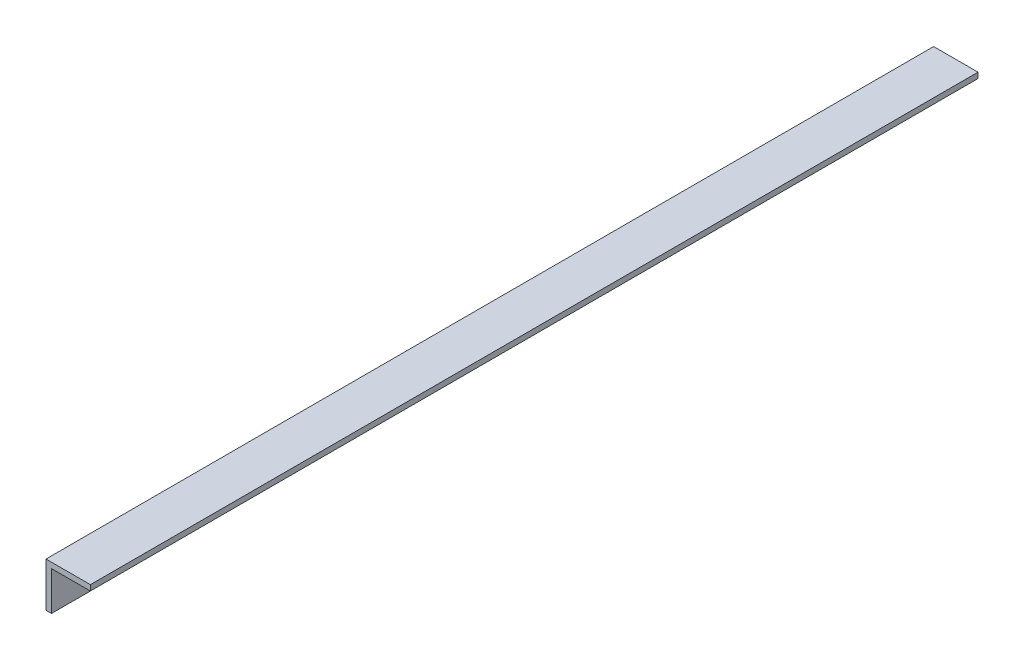
ISO-10303-21;
HEADER;
FILE_DESCRIPTION(('STEP AP214'),'2;1');
FILE_NAME('part.step','',(''),(''),'','','');
FILE_SCHEMA(('AUTOMOTIVE_DESIGN { 1 0 10303 214 1 1 1 1 }'));
ENDSEC;
DATA;
#1=APPLICATION_CONTEXT('core data for automotive mechanical design processes');
#2=APPLICATION_PROTOCOL_DEFINITION('international standard','automotive_design',2000,#1);
#3=PRODUCT_CONTEXT('',#1,'mechanical');
#4=PRODUCT('Part','Part','',(#3));
#5=PRODUCT_RELATED_PRODUCT_CATEGORY('part','',(#4));
#6=PRODUCT_DEFINITION_FORMATION('','',#4);
#7=PRODUCT_DEFINITION_CONTEXT('part definition',#1,'design');
#8=PRODUCT_DEFINITION('design','',#6,#7);
#9=PRODUCT_DEFINITION_SHAPE('','',#8);
#10=(LENGTH_UNIT() NAMED_UNIT(*) SI_UNIT(.MILLI.,.METRE.));
#11=(NAMED_UNIT(*) PLANE_ANGLE_UNIT() SI_UNIT($,.RADIAN.));
#12=(NAMED_UNIT(*) SI_UNIT($,.STERADIAN.) SOLID_ANGLE_UNIT());
#13=UNCERTAINTY_MEASURE_WITH_UNIT(LENGTH_MEASURE(1.E-05),#10,'distance_accuracy_value','');
#14=(GEOMETRIC_REPRESENTATION_CONTEXT(3) GLOBAL_UNCERTAINTY_ASSIGNED_CONTEXT((#13)) GLOBAL_UNIT_ASSIGNED_CONTEXT((#10,
#11,#12)) REPRESENTATION_CONTEXT('',''));
#15=CARTESIAN_POINT('',(0.,0.,0.));
#16=DIRECTION('',(0.,0.,1.));
#17=DIRECTION('',(1.,0.,0.));
#18=AXIS2_PLACEMENT_3D('',#15,#16,#17);
#19=CARTESIAN_POINT('',(3.175,0.,508.));
#20=DIRECTION('',(0.,1.,0.));
#21=DIRECTION('',(-1.,0.,0.));
#22=AXIS2_PLACEMENT_3D('',#19,#20,#21);
#23=PLANE('',#22);
#24=DIRECTION('',(1.,0.,0.));
#25=VECTOR('',#24,1.);
#26=CARTESIAN_POINT('',(3.175,0.,0.));
#27=LINE('',#26,#25);
#28=CARTESIAN_POINT('',(0.,0.,0.));
#29=VERTEX_POINT('',#28);
#30=CARTESIAN_POINT('',(3.175,0.,0.));
#31=VERTEX_POINT('',#30);
#32=EDGE_CURVE('E117',#29,#31,#27,.T.);
#33=ORIENTED_EDGE('',*,*,#32,.T.);
#34=DIRECTION('',(0.,0.,-1.));
#35=VECTOR('',#34,1.);
#36=CARTESIAN_POINT('',(3.175,0.,508.));
#37=LINE('',#36,#35);
#38=CARTESIAN_POINT('',(3.175,0.,508.));
#39=VERTEX_POINT('',#38);
#40=EDGE_CURVE('E11',#39,#31,#37,.T.);
#41=ORIENTED_EDGE('',*,*,#40,.F.);
#42=DIRECTION('',(1.,0.,0.));
#43=VECTOR('',#42,1.);
#44=CARTESIAN_POINT('',(3.175,0.,508.));
#45=LINE('',#44,#43);
#46=CARTESIAN_POINT('',(0.,0.,508.));
#47=VERTEX_POINT('',#46);
#48=EDGE_CURVE('E127',#47,#39,#45,.T.);
#49=ORIENTED_EDGE('',*,*,#48,.F.);
#50=DIRECTION('',(0.,0.,-1.));
#51=VECTOR('',#50,1.);
#52=CARTESIAN_POINT('',(0.,0.,508.));
#53=LINE('',#52,#51);
#54=EDGE_CURVE('E113',#47,#29,#53,.T.);
#55=ORIENTED_EDGE('',*,*,#54,.T.);
#56=EDGE_LOOP('',(#33,#41,#49,#55));
#57=FACE_BOUND('',#56,.T.);
#58=ADVANCED_FACE('F33',(#57),#23,.F.);
#59=CARTESIAN_POINT('',(3.175,22.225,508.));
#60=DIRECTION('',(-1.,0.,0.));
#61=DIRECTION('',(0.,-1.,0.));
#62=AXIS2_PLACEMENT_3D('',#59,#60,#61);
#63=PLANE('',#62);
#64=DIRECTION('',(0.,1.,0.));
#65=VECTOR('',#64,1.);
#66=CARTESIAN_POINT('',(3.175,22.225,0.));
#67=LINE('',#66,#65);
#68=CARTESIAN_POINT('',(3.175,22.225,0.));
#69=VERTEX_POINT('',#68);
#70=EDGE_CURVE('E120',#31,#69,#67,.T.);
#71=ORIENTED_EDGE('',*,*,#70,.T.);
#72=DIRECTION('',(0.,0.,-1.));
#73=VECTOR('',#72,1.);
#74=CARTESIAN_POINT('',(3.175,22.225,508.));
#75=LINE('',#74,#73);
#76=CARTESIAN_POINT('',(3.175,22.225,508.));
#77=VERTEX_POINT('',#76);
#78=EDGE_CURVE('E41',#77,#69,#75,.T.);
#79=ORIENTED_EDGE('',*,*,#78,.F.);
#80=DIRECTION('',(0.,1.,0.));
#81=VECTOR('',#80,1.);
#82=CARTESIAN_POINT('',(3.175,22.225,508.));
#83=LINE('',#82,#81);
#84=EDGE_CURVE('E86',#39,#77,#83,.T.);
#85=ORIENTED_EDGE('',*,*,#84,.F.);
#86=ORIENTED_EDGE('',*,*,#40,.T.);
#87=EDGE_LOOP('',(#71,#79,#85,#86));
#88=FACE_BOUND('',#87,.T.);
#89=ADVANCED_FACE('F151',(#88),#63,.F.);
#90=CARTESIAN_POINT('',(25.4,22.225,508.));
#91=DIRECTION('',(0.,1.,0.));
#92=DIRECTION('',(-1.,0.,0.));
#93=AXIS2_PLACEMENT_3D('',#90,#91,#92);
#94=PLANE('',#93);
#95=DIRECTION('',(1.,0.,0.));
#96=VECTOR('',#95,1.);
#97=CARTESIAN_POINT('',(25.4,22.225,0.));
#98=LINE('',#97,#96);
#99=CARTESIAN_POINT('',(25.4,22.225,0.));
#100=VERTEX_POINT('',#99);
#101=EDGE_CURVE('E122',#69,#100,#98,.T.);
#102=ORIENTED_EDGE('',*,*,#101,.T.);
#103=DIRECTION('',(0.,0.,-1.));
#104=VECTOR('',#103,1.);
#105=CARTESIAN_POINT('',(25.4,22.225,508.));
#106=LINE('',#105,#104);
#107=CARTESIAN_POINT('',(25.4,22.225,508.));
#108=VERTEX_POINT('',#107);
#109=EDGE_CURVE('E108',#108,#100,#106,.T.);
#110=ORIENTED_EDGE('',*,*,#109,.F.);
#111=DIRECTION('',(1.,0.,0.));
#112=VECTOR('',#111,1.);
#113=CARTESIAN_POINT('',(25.4,22.225,508.));
#114=LINE('',#113,#112);
#115=EDGE_CURVE('E99',#77,#108,#114,.T.);
#116=ORIENTED_EDGE('',*,*,#115,.F.);
#117=ORIENTED_EDGE('',*,*,#78,.T.);
#118=EDGE_LOOP('',(#102,#110,#116,#117));
#119=FACE_BOUND('',#118,.T.);
#120=ADVANCED_FACE('F133',(#119),#94,.F.);
#121=CARTESIAN_POINT('',(25.4,25.4,508.));
#122=DIRECTION('',(-1.,0.,0.));
#123=DIRECTION('',(0.,0.,1.));
#124=AXIS2_PLACEMENT_3D('',#121,#122,#123);
#125=PLANE('',#124);
#126=DIRECTION('',(0.,1.,0.));
#127=VECTOR('',#126,1.);
#128=CARTESIAN_POINT('',(25.4,25.4,0.));
#129=LINE('',#128,#127);
#130=CARTESIAN_POINT('',(25.4,25.4,0.));
#131=VERTEX_POINT('',#130);
#132=EDGE_CURVE('E107',#100,#131,#129,.T.);
#133=ORIENTED_EDGE('',*,*,#132,.T.);
#134=DIRECTION('',(0.,0.,-1.));
#135=VECTOR('',#134,1.);
#136=CARTESIAN_POINT('',(25.4,25.4,508.));
#137=LINE('',#136,#135);
#138=CARTESIAN_POINT('',(25.4,25.4,508.));
#139=VERTEX_POINT('',#138);
#140=EDGE_CURVE('E104',#139,#131,#137,.T.);
#141=ORIENTED_EDGE('',*,*,#140,.F.);
#142=DIRECTION('',(0.,1.,0.));
#143=VECTOR('',#142,1.);
#144=CARTESIAN_POINT('',(25.4,25.4,508.));
#145=LINE('',#144,#143);
#146=EDGE_CURVE('E93',#108,#139,#145,.T.);
#147=ORIENTED_EDGE('',*,*,#146,.F.);
#148=ORIENTED_EDGE('',*,*,#109,.T.);
#149=EDGE_LOOP('',(#133,#141,#147,#148));
#150=FACE_BOUND('',#149,.T.);
#151=ADVANCED_FACE('F105',(#150),#125,.F.);
#152=CARTESIAN_POINT('',(0.,25.4,508.));
#153=DIRECTION('',(0.,-1.,0.));
#154=DIRECTION('',(0.,0.,-1.));
#155=AXIS2_PLACEMENT_3D('',#152,#153,#154);
#156=PLANE('',#155);
#157=DIRECTION('',(-1.,0.,0.));
#158=VECTOR('',#157,1.);
#159=CARTESIAN_POINT('',(0.,25.4,0.));
#160=LINE('',#159,#158);
#161=CARTESIAN_POINT('',(0.,25.4,0.));
#162=VERTEX_POINT('',#161);
#163=EDGE_CURVE('E72',#131,#162,#160,.T.);
#164=ORIENTED_EDGE('',*,*,#163,.T.);
#165=DIRECTION('',(0.,0.,-1.));
#166=VECTOR('',#165,1.);
#167=CARTESIAN_POINT('',(0.,25.4,508.));
#168=LINE('',#167,#166);
#169=CARTESIAN_POINT('',(0.,25.4,508.));
#170=VERTEX_POINT('',#169);
#171=EDGE_CURVE('E109',#170,#162,#168,.T.);
#172=ORIENTED_EDGE('',*,*,#171,.F.);
#173=DIRECTION('',(-1.,0.,0.));
#174=VECTOR('',#173,1.);
#175=CARTESIAN_POINT('',(0.,25.4,508.));
#176=LINE('',#175,#174);
#177=EDGE_CURVE('E97',#139,#170,#176,.T.);
#178=ORIENTED_EDGE('',*,*,#177,.F.);
#179=ORIENTED_EDGE('',*,*,#140,.T.);
#180=EDGE_LOOP('',(#164,#172,#178,#179));
#181=FACE_BOUND('',#180,.T.);
#182=ADVANCED_FACE('F111',(#181),#156,.F.);
#183=CARTESIAN_POINT('',(0.,0.,508.));
#184=DIRECTION('',(1.,0.,0.));
#185=DIRECTION('',(0.,0.,-1.));
#186=AXIS2_PLACEMENT_3D('',#183,#184,#185);
#187=PLANE('',#186);
#188=DIRECTION('',(0.,-1.,0.));
#189=VECTOR('',#188,1.);
#190=CARTESIAN_POINT('',(0.,0.,0.));
#191=LINE('',#190,#189);
#192=EDGE_CURVE('E78',#162,#29,#191,.T.);
#193=ORIENTED_EDGE('',*,*,#192,.T.);
#194=ORIENTED_EDGE('',*,*,#54,.F.);
#195=DIRECTION('',(0.,-1.,0.));
#196=VECTOR('',#195,1.);
#197=CARTESIAN_POINT('',(0.,0.,508.));
#198=LINE('',#197,#196);
#199=EDGE_CURVE('E49',#170,#47,#198,.T.);
#200=ORIENTED_EDGE('',*,*,#199,.F.);
#201=ORIENTED_EDGE('',*,*,#171,.T.);
#202=EDGE_LOOP('',(#193,#194,#200,#201));
#203=FACE_BOUND('',#202,.T.);
#204=ADVANCED_FACE('F140',(#203),#187,.F.);
#205=CARTESIAN_POINT('',(0.,0.,508.));
#206=DIRECTION('',(0.,0.,-1.));
#207=DIRECTION('',(-1.,0.,0.));
#208=AXIS2_PLACEMENT_3D('',#205,#206,#207);
#209=PLANE('',#208);
#210=ORIENTED_EDGE('',*,*,#48,.T.);
#211=ORIENTED_EDGE('',*,*,#84,.T.);
#212=ORIENTED_EDGE('',*,*,#115,.T.);
#213=ORIENTED_EDGE('',*,*,#146,.T.);
#214=ORIENTED_EDGE('',*,*,#177,.T.);
#215=ORIENTED_EDGE('',*,*,#199,.T.);
#216=EDGE_LOOP('',(#210,#211,#212,#213,#214,#215));
#217=FACE_BOUND('',#216,.T.);
#218=ADVANCED_FACE('F95',(#217),#209,.F.);
#219=CARTESIAN_POINT('',(0.,0.,0.));
#220=DIRECTION('',(0.,0.,-1.));
#221=DIRECTION('',(-1.,0.,0.));
#222=AXIS2_PLACEMENT_3D('',#219,#220,#221);
#223=PLANE('',#222);
#224=ORIENTED_EDGE('',*,*,#32,.F.);
#225=ORIENTED_EDGE('',*,*,#192,.F.);
#226=ORIENTED_EDGE('',*,*,#163,.F.);
#227=ORIENTED_EDGE('',*,*,#132,.F.);
#228=ORIENTED_EDGE('',*,*,#101,.F.);
#229=ORIENTED_EDGE('',*,*,#70,.F.);
#230=EDGE_LOOP('',(#224,#225,#226,#227,#228,#229));
#231=FACE_BOUND('',#230,.T.);
#232=ADVANCED_FACE('F136',(#231),#223,.T.);
#233=CLOSED_SHELL('',(#58,#89,#120,#151,#182,#204,#218,#232));
#234=MANIFOLD_SOLID_BREP('B2',#233);
#235=ADVANCED_BREP_SHAPE_REPRESENTATION('',(#18,#234),#14);
#236=SHAPE_DEFINITION_REPRESENTATION(#9,#235);
ENDSEC;
END-ISO-10303-21;
